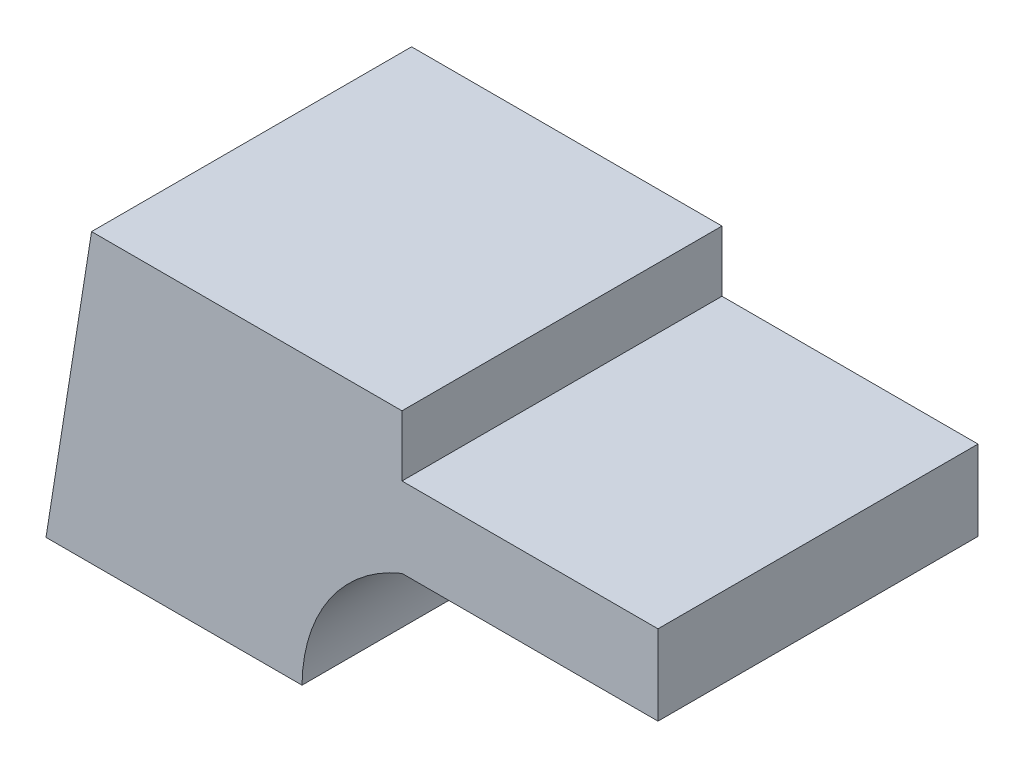
ISO-10303-21;
HEADER;
FILE_DESCRIPTION(('STEP AP214'),'2;1');
FILE_NAME('part.step','',(''),(''),'','','');
FILE_SCHEMA(('AUTOMOTIVE_DESIGN { 1 0 10303 214 1 1 1 1 }'));
ENDSEC;
DATA;
#1=APPLICATION_CONTEXT('core data for automotive mechanical design processes');
#2=APPLICATION_PROTOCOL_DEFINITION('international standard','automotive_design',2000,#1);
#3=PRODUCT_CONTEXT('',#1,'mechanical');
#4=PRODUCT('Part','Part','',(#3));
#5=PRODUCT_RELATED_PRODUCT_CATEGORY('part','',(#4));
#6=PRODUCT_DEFINITION_FORMATION('','',#4);
#7=PRODUCT_DEFINITION_CONTEXT('part definition',#1,'design');
#8=PRODUCT_DEFINITION('design','',#6,#7);
#9=PRODUCT_DEFINITION_SHAPE('','',#8);
#10=(LENGTH_UNIT() NAMED_UNIT(*) SI_UNIT(.MILLI.,.METRE.));
#11=(NAMED_UNIT(*) PLANE_ANGLE_UNIT() SI_UNIT($,.RADIAN.));
#12=(NAMED_UNIT(*) SI_UNIT($,.STERADIAN.) SOLID_ANGLE_UNIT());
#13=UNCERTAINTY_MEASURE_WITH_UNIT(LENGTH_MEASURE(1.E-05),#10,'distance_accuracy_value','');
#14=(GEOMETRIC_REPRESENTATION_CONTEXT(3) GLOBAL_UNCERTAINTY_ASSIGNED_CONTEXT((#13)) GLOBAL_UNIT_ASSIGNED_CONTEXT((#10,
#11,#12)) REPRESENTATION_CONTEXT('',''));
#15=CARTESIAN_POINT('',(0.,0.,0.));
#16=DIRECTION('',(0.,0.,1.));
#17=DIRECTION('',(1.,0.,0.));
#18=AXIS2_PLACEMENT_3D('',#15,#16,#17);
#19=CARTESIAN_POINT('',(-54.5499232615915,1.65868745487596,100.));
#20=DIRECTION('',(0.987688340595138,-0.156434465040228,0.));
#21=DIRECTION('',(0.156434465040228,0.987688340595138,0.));
#22=AXIS2_PLACEMENT_3D('',#19,#20,#21);
#23=PLANE('',#22);
#24=DIRECTION('',(-0.156434465040228,-0.987688340595138,0.));
#25=VECTOR('',#24,1.);
#26=CARTESIAN_POINT('',(-54.5499232615915,1.65868745487596,0.));
#27=LINE('',#26,#25);
#28=CARTESIAN_POINT('',(-40.3143869429307,91.5383264490335,0.));
#29=VERTEX_POINT('',#28);
#30=CARTESIAN_POINT('',(-54.5499232615915,1.65868745487596,0.));
#31=VERTEX_POINT('',#30);
#32=EDGE_CURVE('E139',#29,#31,#27,.T.);
#33=ORIENTED_EDGE('',*,*,#32,.T.);
#34=DIRECTION('',(0.,0.,-1.));
#35=VECTOR('',#34,1.);
#36=CARTESIAN_POINT('',(-54.5499232615915,1.65868745487596,100.));
#37=LINE('',#36,#35);
#38=CARTESIAN_POINT('',(-54.5499232615915,1.65868745487596,100.));
#39=VERTEX_POINT('',#38);
#40=EDGE_CURVE('E11',#39,#31,#37,.T.);
#41=ORIENTED_EDGE('',*,*,#40,.F.);
#42=DIRECTION('',(-0.156434465040228,-0.987688340595138,0.));
#43=VECTOR('',#42,1.);
#44=CARTESIAN_POINT('',(-54.5499232615915,1.65868745487596,100.));
#45=LINE('',#44,#43);
#46=CARTESIAN_POINT('',(-40.3143869429307,91.5383264490335,100.));
#47=VERTEX_POINT('',#46);
#48=EDGE_CURVE('E151',#47,#39,#45,.T.);
#49=ORIENTED_EDGE('',*,*,#48,.F.);
#50=DIRECTION('',(0.,0.,-1.));
#51=VECTOR('',#50,1.);
#52=CARTESIAN_POINT('',(-40.3143869429307,91.5383264490335,100.));
#53=LINE('',#52,#51);
#54=EDGE_CURVE('E133',#47,#29,#53,.T.);
#55=ORIENTED_EDGE('',*,*,#54,.T.);
#56=EDGE_LOOP('',(#33,#41,#49,#55));
#57=FACE_BOUND('',#56,.T.);
#58=ADVANCED_FACE('F39',(#57),#23,.F.);
#59=CARTESIAN_POINT('',(-54.5499232615915,1.65868745487596,100.));
#60=DIRECTION('',(0.,1.,0.));
#61=DIRECTION('',(-1.,0.,0.));
#62=AXIS2_PLACEMENT_3D('',#59,#60,#61);
#63=PLANE('',#62);
#64=DIRECTION('',(1.,0.,0.));
#65=VECTOR('',#64,1.);
#66=CARTESIAN_POINT('',(-54.5499232615915,1.65868745487596,0.));
#67=LINE('',#66,#65);
#68=CARTESIAN_POINT('',(25.4500767384085,1.65868745487596,0.));
#69=VERTEX_POINT('',#68);
#70=EDGE_CURVE('E142',#31,#69,#67,.T.);
#71=ORIENTED_EDGE('',*,*,#70,.T.);
#72=DIRECTION('',(0.,0.,-1.));
#73=VECTOR('',#72,1.);
#74=CARTESIAN_POINT('',(25.4500767384085,1.65868745487596,100.));
#75=LINE('',#74,#73);
#76=CARTESIAN_POINT('',(25.4500767384085,1.65868745487596,100.));
#77=VERTEX_POINT('',#76);
#78=EDGE_CURVE('E46',#77,#69,#75,.T.);
#79=ORIENTED_EDGE('',*,*,#78,.F.);
#80=DIRECTION('',(1.,0.,0.));
#81=VECTOR('',#80,1.);
#82=CARTESIAN_POINT('',(-54.5499232615915,1.65868745487596,100.));
#83=LINE('',#82,#81);
#84=EDGE_CURVE('E90',#39,#77,#83,.T.);
#85=ORIENTED_EDGE('',*,*,#84,.F.);
#86=ORIENTED_EDGE('',*,*,#40,.T.);
#87=EDGE_LOOP('',(#71,#79,#85,#86));
#88=FACE_BOUND('',#87,.T.);
#89=ADVANCED_FACE('F179',(#88),#63,.F.);
#90=CARTESIAN_POINT('',(75.4478992587674,1.19205781297643,100.));
#91=DIRECTION('',(0.,0.,-1.));
#92=DIRECTION('',(-1.,0.,0.));
#93=AXIS2_PLACEMENT_3D('',#90,#91,#92);
#94=CYLINDRICAL_SURFACE('',#93,50.);
#95=CARTESIAN_POINT('',(75.4478992587674,1.19205781297643,0.));
#96=DIRECTION('',(0.,0.,-1.));
#97=DIRECTION('',(-1.,0.,0.));
#98=AXIS2_PLACEMENT_3D('',#95,#96,#97);
#99=CIRCLE('',#98,50.);
#100=CARTESIAN_POINT('',(56.6856130570693,47.5383264490335,0.));
#101=VERTEX_POINT('',#100);
#102=EDGE_CURVE('E145',#69,#101,#99,.T.);
#103=ORIENTED_EDGE('',*,*,#102,.T.);
#104=DIRECTION('',(0.,0.,-1.));
#105=VECTOR('',#104,1.);
#106=CARTESIAN_POINT('',(56.6856130570693,47.5383264490335,100.));
#107=LINE('',#106,#105);
#108=CARTESIAN_POINT('',(56.6856130570693,47.5383264490335,100.));
#109=VERTEX_POINT('',#108);
#110=EDGE_CURVE('E154',#109,#101,#107,.T.);
#111=ORIENTED_EDGE('',*,*,#110,.F.);
#112=CARTESIAN_POINT('',(75.4478992587674,1.19205781297643,100.));
#113=DIRECTION('',(0.,0.,-1.));
#114=DIRECTION('',(-1.,0.,0.));
#115=AXIS2_PLACEMENT_3D('',#112,#113,#114);
#116=CIRCLE('',#115,50.);
#117=EDGE_CURVE('E131',#77,#109,#116,.T.);
#118=ORIENTED_EDGE('',*,*,#117,.F.);
#119=ORIENTED_EDGE('',*,*,#78,.T.);
#120=EDGE_LOOP('',(#103,#111,#118,#119));
#121=FACE_BOUND('',#120,.T.);
#122=ADVANCED_FACE('F159',(#121),#94,.F.);
#123=CARTESIAN_POINT('',(56.6856130570693,91.5383264490335,100.));
#124=DIRECTION('',(-1.,0.,0.));
#125=DIRECTION('',(0.,-1.,0.));
#126=AXIS2_PLACEMENT_3D('',#123,#124,#125);
#127=PLANE('',#126);
#128=DIRECTION('',(0.,1.,0.));
#129=VECTOR('',#128,1.);
#130=CARTESIAN_POINT('',(56.6856130570693,91.5383264490335,100.));
#131=LINE('',#130,#129);
#132=CARTESIAN_POINT('',(56.6856130570693,72.5383264490335,100.));
#133=VERTEX_POINT('',#132);
#134=CARTESIAN_POINT('',(56.6856130570693,91.5383264490335,100.));
#135=VERTEX_POINT('',#134);
#136=EDGE_CURVE('E122',#133,#135,#131,.T.);
#137=ORIENTED_EDGE('',*,*,#136,.F.);
#138=DIRECTION('',(0.,0.,-1.));
#139=VECTOR('',#138,1.);
#140=CARTESIAN_POINT('',(56.6856130570693,72.5383264490335,100.));
#141=LINE('',#140,#139);
#142=CARTESIAN_POINT('',(56.6856130570693,72.5383264490335,0.));
#143=VERTEX_POINT('',#142);
#144=EDGE_CURVE('E110',#133,#143,#141,.T.);
#145=ORIENTED_EDGE('',*,*,#144,.T.);
#146=DIRECTION('',(0.,1.,0.));
#147=VECTOR('',#146,1.);
#148=CARTESIAN_POINT('',(56.6856130570693,91.5383264490335,0.));
#149=LINE('',#148,#147);
#150=CARTESIAN_POINT('',(56.6856130570693,91.5383264490335,0.));
#151=VERTEX_POINT('',#150);
#152=EDGE_CURVE('E148',#143,#151,#149,.T.);
#153=ORIENTED_EDGE('',*,*,#152,.T.);
#154=DIRECTION('',(0.,0.,-1.));
#155=VECTOR('',#154,1.);
#156=CARTESIAN_POINT('',(56.6856130570693,91.5383264490335,100.));
#157=LINE('',#156,#155);
#158=EDGE_CURVE('E130',#135,#151,#157,.T.);
#159=ORIENTED_EDGE('',*,*,#158,.F.);
#160=EDGE_LOOP('',(#137,#145,#153,#159));
#161=FACE_BOUND('',#160,.T.);
#162=ADVANCED_FACE('F129',(#161),#127,.F.);
#163=CARTESIAN_POINT('',(-40.3143869429307,91.5383264490335,100.));
#164=DIRECTION('',(0.,-1.,0.));
#165=DIRECTION('',(0.,0.,-1.));
#166=AXIS2_PLACEMENT_3D('',#163,#164,#165);
#167=PLANE('',#166);
#168=DIRECTION('',(-1.,0.,0.));
#169=VECTOR('',#168,1.);
#170=CARTESIAN_POINT('',(-40.3143869429307,91.5383264490335,0.));
#171=LINE('',#170,#169);
#172=EDGE_CURVE('E83',#151,#29,#171,.T.);
#173=ORIENTED_EDGE('',*,*,#172,.T.);
#174=ORIENTED_EDGE('',*,*,#54,.F.);
#175=DIRECTION('',(-1.,0.,0.));
#176=VECTOR('',#175,1.);
#177=CARTESIAN_POINT('',(-40.3143869429307,91.5383264490335,100.));
#178=LINE('',#177,#176);
#179=EDGE_CURVE('E62',#135,#47,#178,.T.);
#180=ORIENTED_EDGE('',*,*,#179,.F.);
#181=ORIENTED_EDGE('',*,*,#158,.T.);
#182=EDGE_LOOP('',(#173,#174,#180,#181));
#183=FACE_BOUND('',#182,.T.);
#184=ADVANCED_FACE('F190',(#183),#167,.F.);
#185=CARTESIAN_POINT('',(75.4478992587674,1.19205781297643,100.));
#186=DIRECTION('',(0.,0.,-1.));
#187=DIRECTION('',(-1.,0.,0.));
#188=AXIS2_PLACEMENT_3D('',#185,#186,#187);
#189=PLANE('',#188);
#190=ORIENTED_EDGE('',*,*,#48,.T.);
#191=ORIENTED_EDGE('',*,*,#84,.T.);
#192=ORIENTED_EDGE('',*,*,#117,.T.);
#193=DIRECTION('',(-1.,0.,0.));
#194=VECTOR('',#193,1.);
#195=CARTESIAN_POINT('',(56.6856130570693,47.5383264490335,100.));
#196=LINE('',#195,#194);
#197=CARTESIAN_POINT('',(136.685613057069,47.5383264490335,100.));
#198=VERTEX_POINT('',#197);
#199=EDGE_CURVE('E118',#198,#109,#196,.T.);
#200=ORIENTED_EDGE('',*,*,#199,.F.);
#201=DIRECTION('',(0.,-1.,0.));
#202=VECTOR('',#201,1.);
#203=CARTESIAN_POINT('',(136.685613057069,47.5383264490335,100.));
#204=LINE('',#203,#202);
#205=CARTESIAN_POINT('',(136.685613057069,72.5383264490335,100.));
#206=VERTEX_POINT('',#205);
#207=EDGE_CURVE('E126',#206,#198,#204,.T.);
#208=ORIENTED_EDGE('',*,*,#207,.F.);
#209=DIRECTION('',(1.,0.,0.));
#210=VECTOR('',#209,1.);
#211=CARTESIAN_POINT('',(56.6856130570693,72.5383264490335,100.));
#212=LINE('',#211,#210);
#213=EDGE_CURVE('E113',#133,#206,#212,.T.);
#214=ORIENTED_EDGE('',*,*,#213,.F.);
#215=ORIENTED_EDGE('',*,*,#136,.T.);
#216=ORIENTED_EDGE('',*,*,#179,.T.);
#217=EDGE_LOOP('',(#190,#191,#192,#200,#208,#214,#215,#216));
#218=FACE_BOUND('',#217,.T.);
#219=ADVANCED_FACE('F121',(#218),#189,.F.);
#220=CARTESIAN_POINT('',(75.4478992587674,1.19205781297643,0.));
#221=DIRECTION('',(0.,0.,-1.));
#222=DIRECTION('',(-1.,0.,0.));
#223=AXIS2_PLACEMENT_3D('',#220,#221,#222);
#224=PLANE('',#223);
#225=ORIENTED_EDGE('',*,*,#32,.F.);
#226=ORIENTED_EDGE('',*,*,#172,.F.);
#227=ORIENTED_EDGE('',*,*,#152,.F.);
#228=DIRECTION('',(1.,0.,0.));
#229=VECTOR('',#228,1.);
#230=CARTESIAN_POINT('',(56.6856130570693,72.5383264490335,0.));
#231=LINE('',#230,#229);
#232=CARTESIAN_POINT('',(136.685613057069,72.5383264490335,0.));
#233=VERTEX_POINT('',#232);
#234=EDGE_CURVE('E53',#143,#233,#231,.T.);
#235=ORIENTED_EDGE('',*,*,#234,.T.);
#236=DIRECTION('',(0.,-1.,0.));
#237=VECTOR('',#236,1.);
#238=CARTESIAN_POINT('',(136.685613057069,47.5383264490335,0.));
#239=LINE('',#238,#237);
#240=CARTESIAN_POINT('',(136.685613057069,47.5383264490335,0.));
#241=VERTEX_POINT('',#240);
#242=EDGE_CURVE('E168',#233,#241,#239,.T.);
#243=ORIENTED_EDGE('',*,*,#242,.T.);
#244=DIRECTION('',(-1.,0.,0.));
#245=VECTOR('',#244,1.);
#246=CARTESIAN_POINT('',(56.6856130570693,47.5383264490335,0.));
#247=LINE('',#246,#245);
#248=EDGE_CURVE('E127',#241,#101,#247,.T.);
#249=ORIENTED_EDGE('',*,*,#248,.T.);
#250=ORIENTED_EDGE('',*,*,#102,.F.);
#251=ORIENTED_EDGE('',*,*,#70,.F.);
#252=EDGE_LOOP('',(#225,#226,#227,#235,#243,#249,#250,#251));
#253=FACE_BOUND('',#252,.T.);
#254=ADVANCED_FACE('F164',(#253),#224,.T.);
#255=CARTESIAN_POINT('',(56.6856130570693,47.5383264490335,100.));
#256=DIRECTION('',(0.,-1.,0.));
#257=DIRECTION('',(1.,0.,0.));
#258=AXIS2_PLACEMENT_3D('',#255,#256,#257);
#259=PLANE('',#258);
#260=ORIENTED_EDGE('',*,*,#248,.F.);
#261=DIRECTION('',(0.,0.,-1.));
#262=VECTOR('',#261,1.);
#263=CARTESIAN_POINT('',(136.685613057069,47.5383264490335,100.));
#264=LINE('',#263,#262);
#265=EDGE_CURVE('E143',#198,#241,#264,.T.);
#266=ORIENTED_EDGE('',*,*,#265,.F.);
#267=ORIENTED_EDGE('',*,*,#199,.T.);
#268=ORIENTED_EDGE('',*,*,#110,.T.);
#269=EDGE_LOOP('',(#260,#266,#267,#268));
#270=FACE_BOUND('',#269,.T.);
#271=ADVANCED_FACE('F194',(#270),#259,.T.);
#272=CARTESIAN_POINT('',(136.685613057069,47.5383264490335,100.));
#273=DIRECTION('',(1.,0.,0.));
#274=DIRECTION('',(0.,0.,-1.));
#275=AXIS2_PLACEMENT_3D('',#272,#273,#274);
#276=PLANE('',#275);
#277=ORIENTED_EDGE('',*,*,#242,.F.);
#278=DIRECTION('',(0.,0.,-1.));
#279=VECTOR('',#278,1.);
#280=CARTESIAN_POINT('',(136.685613057069,72.5383264490335,100.));
#281=LINE('',#280,#279);
#282=EDGE_CURVE('E117',#206,#233,#281,.T.);
#283=ORIENTED_EDGE('',*,*,#282,.F.);
#284=ORIENTED_EDGE('',*,*,#207,.T.);
#285=ORIENTED_EDGE('',*,*,#265,.T.);
#286=EDGE_LOOP('',(#277,#283,#284,#285));
#287=FACE_BOUND('',#286,.T.);
#288=ADVANCED_FACE('F199',(#287),#276,.T.);
#289=CARTESIAN_POINT('',(56.6856130570693,72.5383264490335,100.));
#290=DIRECTION('',(0.,1.,0.));
#291=DIRECTION('',(-1.,0.,0.));
#292=AXIS2_PLACEMENT_3D('',#289,#290,#291);
#293=PLANE('',#292);
#294=ORIENTED_EDGE('',*,*,#234,.F.);
#295=ORIENTED_EDGE('',*,*,#144,.F.);
#296=ORIENTED_EDGE('',*,*,#213,.T.);
#297=ORIENTED_EDGE('',*,*,#282,.T.);
#298=EDGE_LOOP('',(#294,#295,#296,#297));
#299=FACE_BOUND('',#298,.T.);
#300=ADVANCED_FACE('F112',(#299),#293,.T.);
#301=CLOSED_SHELL('',(#58,#89,#122,#162,#184,#219,#254,#271,#288,#300));
#302=MANIFOLD_SOLID_BREP('B2',#301);
#303=ADVANCED_BREP_SHAPE_REPRESENTATION('',(#18,#302),#14);
#304=SHAPE_DEFINITION_REPRESENTATION(#9,#303);
ENDSEC;
END-ISO-10303-21;
